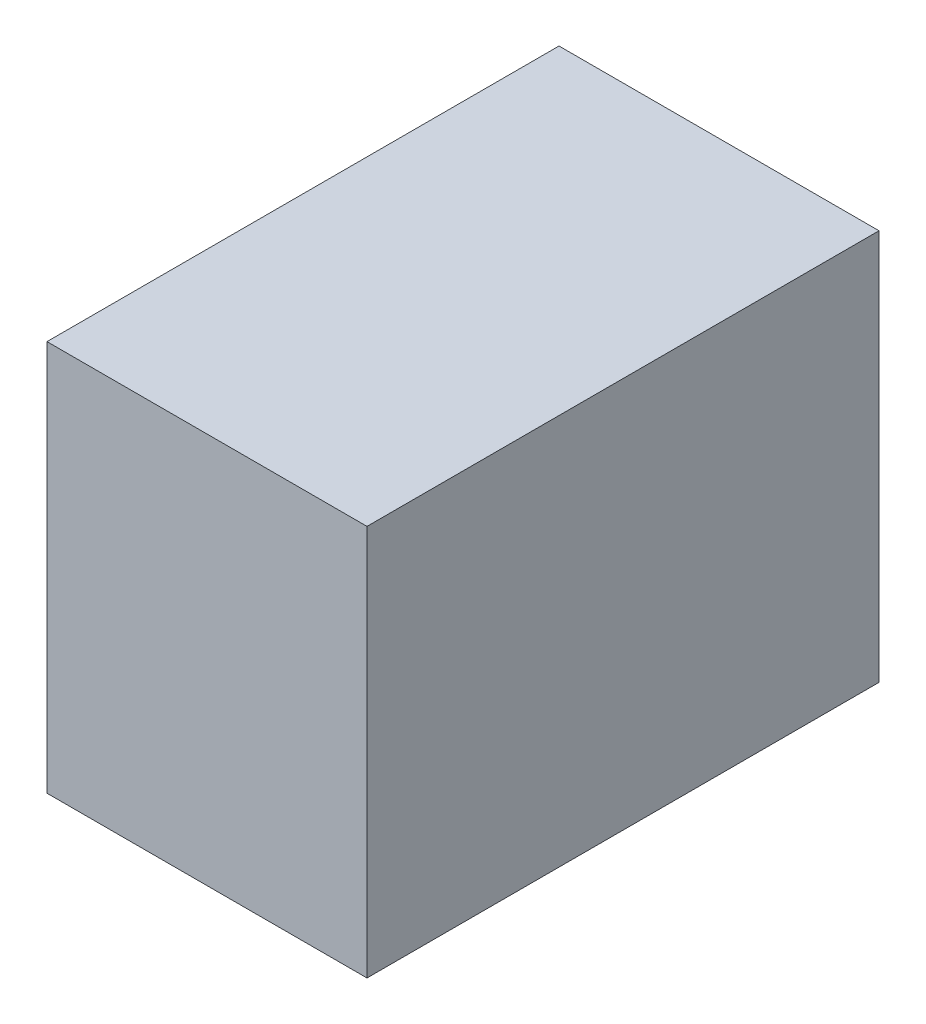
ISO-10303-21;
HEADER;
FILE_DESCRIPTION(('STEP AP214'),'2;1');
FILE_NAME('part.step','',(''),(''),'','','');
FILE_SCHEMA(('AUTOMOTIVE_DESIGN { 1 0 10303 214 1 1 1 1 }'));
ENDSEC;
DATA;
#1=APPLICATION_CONTEXT('core data for automotive mechanical design processes');
#2=APPLICATION_PROTOCOL_DEFINITION('international standard','automotive_design',2000,#1);
#3=PRODUCT_CONTEXT('',#1,'mechanical');
#4=PRODUCT('Part','Part','',(#3));
#5=PRODUCT_RELATED_PRODUCT_CATEGORY('part','',(#4));
#6=PRODUCT_DEFINITION_FORMATION('','',#4);
#7=PRODUCT_DEFINITION_CONTEXT('part definition',#1,'design');
#8=PRODUCT_DEFINITION('design','',#6,#7);
#9=PRODUCT_DEFINITION_SHAPE('','',#8);
#10=(LENGTH_UNIT() NAMED_UNIT(*) SI_UNIT(.MILLI.,.METRE.));
#11=(NAMED_UNIT(*) PLANE_ANGLE_UNIT() SI_UNIT($,.RADIAN.));
#12=(NAMED_UNIT(*) SI_UNIT($,.STERADIAN.) SOLID_ANGLE_UNIT());
#13=UNCERTAINTY_MEASURE_WITH_UNIT(LENGTH_MEASURE(1.E-05),#10,'distance_accuracy_value','');
#14=(GEOMETRIC_REPRESENTATION_CONTEXT(3) GLOBAL_UNCERTAINTY_ASSIGNED_CONTEXT((#13)) GLOBAL_UNIT_ASSIGNED_CONTEXT((#10,
#11,#12)) REPRESENTATION_CONTEXT('',''));
#15=CARTESIAN_POINT('',(0.,0.,0.));
#16=DIRECTION('',(0.,0.,1.));
#17=DIRECTION('',(1.,0.,0.));
#18=AXIS2_PLACEMENT_3D('',#15,#16,#17);
#19=CARTESIAN_POINT('',(0.,0.,0.));
#20=DIRECTION('',(0.,0.,-1.));
#21=DIRECTION('',(-1.,0.,0.));
#22=AXIS2_PLACEMENT_3D('',#19,#20,#21);
#23=PLANE('',#22);
#24=DIRECTION('',(0.,-1.,0.));
#25=VECTOR('',#24,1.);
#26=CARTESIAN_POINT('',(31.716,26.6,0.));
#27=LINE('',#26,#25);
#28=CARTESIAN_POINT('',(31.716,37.6,0.));
#29=VERTEX_POINT('',#28);
#30=CARTESIAN_POINT('',(31.716,26.6,0.));
#31=VERTEX_POINT('',#30);
#32=EDGE_CURVE('E90',#29,#31,#27,.T.);
#33=ORIENTED_EDGE('',*,*,#32,.F.);
#34=DIRECTION('',(-1.,0.,0.));
#35=VECTOR('',#34,1.);
#36=CARTESIAN_POINT('',(31.716,37.6,0.));
#37=LINE('',#36,#35);
#38=CARTESIAN_POINT('',(40.716,37.6,0.));
#39=VERTEX_POINT('',#38);
#40=EDGE_CURVE('E57',#39,#29,#37,.T.);
#41=ORIENTED_EDGE('',*,*,#40,.F.);
#42=DIRECTION('',(0.,1.,0.));
#43=VECTOR('',#42,1.);
#44=CARTESIAN_POINT('',(40.716,26.6,0.));
#45=LINE('',#44,#43);
#46=CARTESIAN_POINT('',(40.716,26.6,0.));
#47=VERTEX_POINT('',#46);
#48=EDGE_CURVE('E63',#47,#39,#45,.T.);
#49=ORIENTED_EDGE('',*,*,#48,.F.);
#50=DIRECTION('',(1.,0.,0.));
#51=VECTOR('',#50,1.);
#52=CARTESIAN_POINT('',(31.716,26.6,0.));
#53=LINE('',#52,#51);
#54=EDGE_CURVE('E120',#31,#47,#53,.T.);
#55=ORIENTED_EDGE('',*,*,#54,.F.);
#56=EDGE_LOOP('',(#33,#41,#49,#55));
#57=FACE_BOUND('',#56,.T.);
#58=CARTESIAN_POINT('',(36.216,33.1,0.));
#59=DIRECTION('',(0.,0.,1.));
#60=DIRECTION('',(1.,0.,0.));
#61=AXIS2_PLACEMENT_3D('',#58,#59,#60);
#62=CIRCLE('',#61,3.25);
#63=CARTESIAN_POINT('',(39.466,33.1,0.));
#64=VERTEX_POINT('',#63);
#65=EDGE_CURVE('E113',#64,#64,#62,.T.);
#66=ORIENTED_EDGE('',*,*,#65,.T.);
#67=EDGE_LOOP('',(#66));
#68=FACE_BOUND('',#67,.T.);
#69=ADVANCED_FACE('F41',(#57,#68),#23,.T.);
#70=CARTESIAN_POINT('',(31.716,26.6,9.5));
#71=DIRECTION('',(1.,0.,0.));
#72=DIRECTION('',(0.,0.,-1.));
#73=AXIS2_PLACEMENT_3D('',#70,#71,#72);
#74=PLANE('',#73);
#75=ORIENTED_EDGE('',*,*,#32,.T.);
#76=DIRECTION('',(0.,0.,-1.));
#77=VECTOR('',#76,1.);
#78=CARTESIAN_POINT('',(31.716,26.6,9.5));
#79=LINE('',#78,#77);
#80=CARTESIAN_POINT('',(31.716,26.6,14.4));
#81=VERTEX_POINT('',#80);
#82=EDGE_CURVE('E11',#81,#31,#79,.T.);
#83=ORIENTED_EDGE('',*,*,#82,.F.);
#84=DIRECTION('',(0.,-1.,0.));
#85=VECTOR('',#84,1.);
#86=CARTESIAN_POINT('',(31.716,26.6,14.4));
#87=LINE('',#86,#85);
#88=CARTESIAN_POINT('',(31.716,37.6,14.4));
#89=VERTEX_POINT('',#88);
#90=EDGE_CURVE('E85',#89,#81,#87,.T.);
#91=ORIENTED_EDGE('',*,*,#90,.F.);
#92=DIRECTION('',(0.,0.,-1.));
#93=VECTOR('',#92,1.);
#94=CARTESIAN_POINT('',(31.716,37.6,9.5));
#95=LINE('',#94,#93);
#96=EDGE_CURVE('E122',#89,#29,#95,.T.);
#97=ORIENTED_EDGE('',*,*,#96,.T.);
#98=EDGE_LOOP('',(#75,#83,#91,#97));
#99=FACE_BOUND('',#98,.T.);
#100=ADVANCED_FACE('F43',(#99),#74,.F.);
#101=CARTESIAN_POINT('',(31.716,26.6,9.5));
#102=DIRECTION('',(0.,1.,0.));
#103=DIRECTION('',(0.,0.,1.));
#104=AXIS2_PLACEMENT_3D('',#101,#102,#103);
#105=PLANE('',#104);
#106=ORIENTED_EDGE('',*,*,#54,.T.);
#107=DIRECTION('',(0.,0.,-1.));
#108=VECTOR('',#107,1.);
#109=CARTESIAN_POINT('',(40.716,26.6,9.5));
#110=LINE('',#109,#108);
#111=CARTESIAN_POINT('',(40.716,26.6,14.4));
#112=VERTEX_POINT('',#111);
#113=EDGE_CURVE('E47',#112,#47,#110,.T.);
#114=ORIENTED_EDGE('',*,*,#113,.F.);
#115=DIRECTION('',(1.,0.,0.));
#116=VECTOR('',#115,1.);
#117=CARTESIAN_POINT('',(31.716,26.6,14.4));
#118=LINE('',#117,#116);
#119=EDGE_CURVE('E86',#81,#112,#118,.T.);
#120=ORIENTED_EDGE('',*,*,#119,.F.);
#121=ORIENTED_EDGE('',*,*,#82,.T.);
#122=EDGE_LOOP('',(#106,#114,#120,#121));
#123=FACE_BOUND('',#122,.T.);
#124=ADVANCED_FACE('F91',(#123),#105,.F.);
#125=CARTESIAN_POINT('',(40.716,26.6,9.5));
#126=DIRECTION('',(-1.,0.,0.));
#127=DIRECTION('',(0.,0.,1.));
#128=AXIS2_PLACEMENT_3D('',#125,#126,#127);
#129=PLANE('',#128);
#130=ORIENTED_EDGE('',*,*,#48,.T.);
#131=DIRECTION('',(0.,0.,-1.));
#132=VECTOR('',#131,1.);
#133=CARTESIAN_POINT('',(40.716,37.6,9.5));
#134=LINE('',#133,#132);
#135=CARTESIAN_POINT('',(40.716,37.6,14.4));
#136=VERTEX_POINT('',#135);
#137=EDGE_CURVE('E124',#136,#39,#134,.T.);
#138=ORIENTED_EDGE('',*,*,#137,.F.);
#139=DIRECTION('',(0.,1.,0.));
#140=VECTOR('',#139,1.);
#141=CARTESIAN_POINT('',(40.716,26.6,14.4));
#142=LINE('',#141,#140);
#143=EDGE_CURVE('E95',#112,#136,#142,.T.);
#144=ORIENTED_EDGE('',*,*,#143,.F.);
#145=ORIENTED_EDGE('',*,*,#113,.T.);
#146=EDGE_LOOP('',(#130,#138,#144,#145));
#147=FACE_BOUND('',#146,.T.);
#148=ADVANCED_FACE('F121',(#147),#129,.F.);
#149=CARTESIAN_POINT('',(31.716,37.6,9.5));
#150=DIRECTION('',(0.,-1.,0.));
#151=DIRECTION('',(0.,0.,-1.));
#152=AXIS2_PLACEMENT_3D('',#149,#150,#151);
#153=PLANE('',#152);
#154=ORIENTED_EDGE('',*,*,#40,.T.);
#155=ORIENTED_EDGE('',*,*,#96,.F.);
#156=DIRECTION('',(-1.,0.,0.));
#157=VECTOR('',#156,1.);
#158=CARTESIAN_POINT('',(31.716,37.6,14.4));
#159=LINE('',#158,#157);
#160=EDGE_CURVE('E99',#136,#89,#159,.T.);
#161=ORIENTED_EDGE('',*,*,#160,.F.);
#162=ORIENTED_EDGE('',*,*,#137,.T.);
#163=EDGE_LOOP('',(#154,#155,#161,#162));
#164=FACE_BOUND('',#163,.T.);
#165=ADVANCED_FACE('F134',(#164),#153,.F.);
#166=CARTESIAN_POINT('',(36.216,33.1,9.5));
#167=DIRECTION('',(0.,0.,-1.));
#168=DIRECTION('',(-1.,0.,0.));
#169=AXIS2_PLACEMENT_3D('',#166,#167,#168);
#170=CYLINDRICAL_SURFACE('',#169,3.25);
#171=CARTESIAN_POINT('',(36.216,33.1,9.5));
#172=DIRECTION('',(0.,0.,1.));
#173=DIRECTION('',(1.,0.,0.));
#174=AXIS2_PLACEMENT_3D('',#171,#172,#173);
#175=CIRCLE('',#174,3.25);
#176=CARTESIAN_POINT('',(39.466,33.1,9.5));
#177=VERTEX_POINT('',#176);
#178=EDGE_CURVE('E109',#177,#177,#175,.T.);
#179=ORIENTED_EDGE('',*,*,#178,.T.);
#180=EDGE_LOOP('',(#179));
#181=FACE_BOUND('',#180,.T.);
#182=ORIENTED_EDGE('',*,*,#65,.F.);
#183=EDGE_LOOP('',(#182));
#184=FACE_BOUND('',#183,.T.);
#185=ADVANCED_FACE('F132',(#181,#184),#170,.F.);
#186=CARTESIAN_POINT('',(0.,0.,9.5));
#187=DIRECTION('',(0.,0.,-1.));
#188=DIRECTION('',(-1.,0.,0.));
#189=AXIS2_PLACEMENT_3D('',#186,#187,#188);
#190=PLANE('',#189);
#191=CARTESIAN_POINT('',(36.216,33.1,9.5));
#192=DIRECTION('',(0.,0.,1.));
#193=DIRECTION('',(1.,0.,0.));
#194=AXIS2_PLACEMENT_3D('',#191,#192,#193);
#195=CIRCLE('',#194,1.25);
#196=CARTESIAN_POINT('',(37.466,33.1,9.5));
#197=VERTEX_POINT('',#196);
#198=EDGE_CURVE('E103',#197,#197,#195,.T.);
#199=ORIENTED_EDGE('',*,*,#198,.T.);
#200=EDGE_LOOP('',(#199));
#201=FACE_BOUND('',#200,.T.);
#202=ORIENTED_EDGE('',*,*,#178,.F.);
#203=EDGE_LOOP('',(#202));
#204=FACE_BOUND('',#203,.T.);
#205=ADVANCED_FACE('F133',(#201,#204),#190,.T.);
#206=CARTESIAN_POINT('',(0.,0.,14.4));
#207=DIRECTION('',(0.,0.,-1.));
#208=DIRECTION('',(-1.,0.,0.));
#209=AXIS2_PLACEMENT_3D('',#206,#207,#208);
#210=PLANE('',#209);
#211=ORIENTED_EDGE('',*,*,#90,.T.);
#212=ORIENTED_EDGE('',*,*,#119,.T.);
#213=ORIENTED_EDGE('',*,*,#143,.T.);
#214=ORIENTED_EDGE('',*,*,#160,.T.);
#215=EDGE_LOOP('',(#211,#212,#213,#214));
#216=FACE_BOUND('',#215,.T.);
#217=ADVANCED_FACE('F96',(#216),#210,.F.);
#218=CARTESIAN_POINT('',(36.216,33.1,9.5));
#219=DIRECTION('',(0.,0.,-1.));
#220=DIRECTION('',(-1.,0.,0.));
#221=AXIS2_PLACEMENT_3D('',#218,#219,#220);
#222=CYLINDRICAL_SURFACE('',#221,1.25);
#223=ORIENTED_EDGE('',*,*,#198,.F.);
#224=EDGE_LOOP('',(#223));
#225=FACE_BOUND('',#224,.T.);
#226=CARTESIAN_POINT('',(36.216,33.1,0.));
#227=DIRECTION('',(0.,0.,1.));
#228=DIRECTION('',(1.,0.,0.));
#229=AXIS2_PLACEMENT_3D('',#226,#227,#228);
#230=CIRCLE('',#229,1.25);
#231=CARTESIAN_POINT('',(37.466,33.1,0.));
#232=VERTEX_POINT('',#231);
#233=EDGE_CURVE('E104',#232,#232,#230,.T.);
#234=ORIENTED_EDGE('',*,*,#233,.T.);
#235=EDGE_LOOP('',(#234));
#236=FACE_BOUND('',#235,.T.);
#237=ADVANCED_FACE('F198',(#225,#236),#222,.T.);
#238=CARTESIAN_POINT('',(36.216,33.1,0.));
#239=DIRECTION('',(0.,0.,1.));
#240=DIRECTION('',(1.,0.,0.));
#241=AXIS2_PLACEMENT_3D('',#238,#239,#240);
#242=PLANE('',#241);
#243=ORIENTED_EDGE('',*,*,#233,.F.);
#244=EDGE_LOOP('',(#243));
#245=FACE_BOUND('',#244,.T.);
#246=ADVANCED_FACE('F205',(#245),#242,.F.);
#247=CLOSED_SHELL('',(#69,#100,#124,#148,#165,#185,#205,#217,#237,#246));
#248=MANIFOLD_SOLID_BREP('B2',#247);
#249=ADVANCED_BREP_SHAPE_REPRESENTATION('',(#18,#248),#14);
#250=SHAPE_DEFINITION_REPRESENTATION(#9,#249);
ENDSEC;
END-ISO-10303-21;
